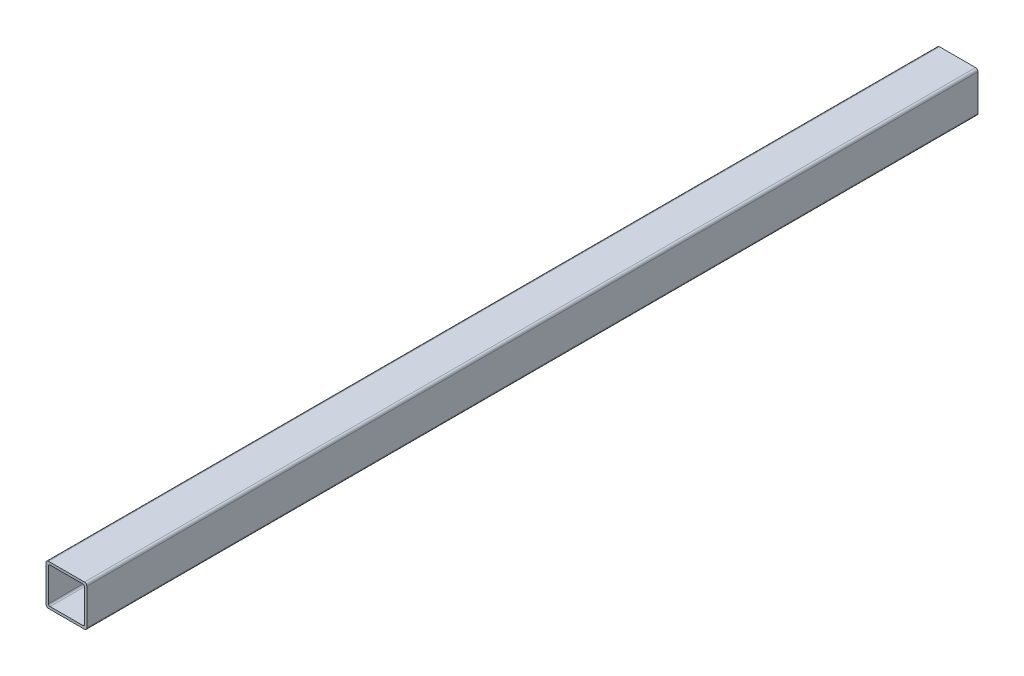
ISO-10303-21;
HEADER;
FILE_DESCRIPTION(('STEP AP214'),'2;1');
FILE_NAME('part.step','',(''),(''),'','','');
FILE_SCHEMA(('AUTOMOTIVE_DESIGN { 1 0 10303 214 1 1 1 1 }'));
ENDSEC;
DATA;
#1=APPLICATION_CONTEXT('core data for automotive mechanical design processes');
#2=APPLICATION_PROTOCOL_DEFINITION('international standard','automotive_design',2000,#1);
#3=PRODUCT_CONTEXT('',#1,'mechanical');
#4=PRODUCT('Part','Part','',(#3));
#5=PRODUCT_RELATED_PRODUCT_CATEGORY('part','',(#4));
#6=PRODUCT_DEFINITION_FORMATION('','',#4);
#7=PRODUCT_DEFINITION_CONTEXT('part definition',#1,'design');
#8=PRODUCT_DEFINITION('design','',#6,#7);
#9=PRODUCT_DEFINITION_SHAPE('','',#8);
#10=(LENGTH_UNIT() NAMED_UNIT(*) SI_UNIT(.MILLI.,.METRE.));
#11=(NAMED_UNIT(*) PLANE_ANGLE_UNIT() SI_UNIT($,.RADIAN.));
#12=(NAMED_UNIT(*) SI_UNIT($,.STERADIAN.) SOLID_ANGLE_UNIT());
#13=UNCERTAINTY_MEASURE_WITH_UNIT(LENGTH_MEASURE(1.E-05),#10,'distance_accuracy_value','');
#14=(GEOMETRIC_REPRESENTATION_CONTEXT(3) GLOBAL_UNCERTAINTY_ASSIGNED_CONTEXT((#13)) GLOBAL_UNIT_ASSIGNED_CONTEXT((#10,
#11,#12)) REPRESENTATION_CONTEXT('',''));
#15=CARTESIAN_POINT('',(0.,0.,0.));
#16=DIRECTION('',(0.,0.,1.));
#17=DIRECTION('',(1.,0.,0.));
#18=AXIS2_PLACEMENT_3D('',#15,#16,#17);
#19=CARTESIAN_POINT('',(-22.,-25.,-1160.71067811867));
#20=DIRECTION('',(0.,-1.,0.));
#21=DIRECTION('',(0.,0.,-1.));
#22=AXIS2_PLACEMENT_3D('',#19,#20,#21);
#23=PLANE('',#22);
#24=DIRECTION('',(-1.,0.,0.));
#25=VECTOR('',#24,1.);
#26=CARTESIAN_POINT('',(-22.,-25.,-1090.00000000001));
#27=LINE('',#26,#25);
#28=CARTESIAN_POINT('',(22.,-25.,-1090.00000000001));
#29=VERTEX_POINT('',#28);
#30=CARTESIAN_POINT('',(-22.,-25.,-1090.00000000001));
#31=VERTEX_POINT('',#30);
#32=EDGE_CURVE('E11',#29,#31,#27,.T.);
#33=ORIENTED_EDGE('',*,*,#32,.F.);
#34=DIRECTION('',(0.,0.,1.));
#35=VECTOR('',#34,1.);
#36=CARTESIAN_POINT('',(22.,-25.,-1160.71067811867));
#37=LINE('',#36,#35);
#38=CARTESIAN_POINT('',(22.,-25.,0.));
#39=VERTEX_POINT('',#38);
#40=EDGE_CURVE('E234',#29,#39,#37,.T.);
#41=ORIENTED_EDGE('',*,*,#40,.T.);
#42=DIRECTION('',(1.,0.,0.));
#43=VECTOR('',#42,1.);
#44=CARTESIAN_POINT('',(-22.,-25.,0.));
#45=LINE('',#44,#43);
#46=CARTESIAN_POINT('',(-22.,-25.,0.));
#47=VERTEX_POINT('',#46);
#48=EDGE_CURVE('E200',#47,#39,#45,.T.);
#49=ORIENTED_EDGE('',*,*,#48,.F.);
#50=DIRECTION('',(0.,0.,1.));
#51=VECTOR('',#50,1.);
#52=CARTESIAN_POINT('',(-22.,-25.,-1160.71067811867));
#53=LINE('',#52,#51);
#54=EDGE_CURVE('E221',#31,#47,#53,.T.);
#55=ORIENTED_EDGE('',*,*,#54,.F.);
#56=EDGE_LOOP('',(#33,#41,#49,#55));
#57=FACE_BOUND('',#56,.T.);
#58=ADVANCED_FACE('F35',(#57),#23,.T.);
#59=CARTESIAN_POINT('',(22.,-22.,-1160.71067811867));
#60=DIRECTION('',(0.,0.,1.));
#61=DIRECTION('',(1.,0.,0.));
#62=AXIS2_PLACEMENT_3D('',#59,#60,#61);
#63=CYLINDRICAL_SURFACE('',#62,3.);
#64=CARTESIAN_POINT('',(22.,-22.,-1090.00000000001));
#65=DIRECTION('',(0.,0.,1.));
#66=DIRECTION('',(1.,0.,0.));
#67=AXIS2_PLACEMENT_3D('',#64,#65,#66);
#68=CIRCLE('',#67,3.);
#69=CARTESIAN_POINT('',(25.,-22.,-1090.00000000001));
#70=VERTEX_POINT('',#69);
#71=EDGE_CURVE('E301',#70,#29,#68,.F.);
#72=ORIENTED_EDGE('',*,*,#71,.F.);
#73=DIRECTION('',(0.,0.,1.));
#74=VECTOR('',#73,1.);
#75=CARTESIAN_POINT('',(25.,-22.,-1160.71067811867));
#76=LINE('',#75,#74);
#77=CARTESIAN_POINT('',(25.,-22.,0.));
#78=VERTEX_POINT('',#77);
#79=EDGE_CURVE('E232',#70,#78,#76,.T.);
#80=ORIENTED_EDGE('',*,*,#79,.T.);
#81=CARTESIAN_POINT('',(22.,-22.,0.));
#82=DIRECTION('',(0.,0.,1.));
#83=DIRECTION('',(1.,0.,0.));
#84=AXIS2_PLACEMENT_3D('',#81,#82,#83);
#85=CIRCLE('',#84,3.);
#86=EDGE_CURVE('E203',#39,#78,#85,.T.);
#87=ORIENTED_EDGE('',*,*,#86,.F.);
#88=ORIENTED_EDGE('',*,*,#40,.F.);
#89=EDGE_LOOP('',(#72,#80,#87,#88));
#90=FACE_BOUND('',#89,.T.);
#91=ADVANCED_FACE('F325',(#90),#63,.T.);
#92=CARTESIAN_POINT('',(25.,22.,-1160.71067811867));
#93=DIRECTION('',(1.,0.,0.));
#94=DIRECTION('',(0.,0.,-1.));
#95=AXIS2_PLACEMENT_3D('',#92,#93,#94);
#96=PLANE('',#95);
#97=DIRECTION('',(0.,-1.,0.));
#98=VECTOR('',#97,1.);
#99=CARTESIAN_POINT('',(25.,22.,-1090.00000000001));
#100=LINE('',#99,#98);
#101=CARTESIAN_POINT('',(25.,22.,-1090.00000000001));
#102=VERTEX_POINT('',#101);
#103=EDGE_CURVE('E303',#102,#70,#100,.T.);
#104=ORIENTED_EDGE('',*,*,#103,.F.);
#105=DIRECTION('',(0.,0.,1.));
#106=VECTOR('',#105,1.);
#107=CARTESIAN_POINT('',(25.,22.,-1160.71067811867));
#108=LINE('',#107,#106);
#109=CARTESIAN_POINT('',(25.,22.,0.));
#110=VERTEX_POINT('',#109);
#111=EDGE_CURVE('E230',#102,#110,#108,.T.);
#112=ORIENTED_EDGE('',*,*,#111,.T.);
#113=DIRECTION('',(0.,1.,0.));
#114=VECTOR('',#113,1.);
#115=CARTESIAN_POINT('',(25.,22.,0.));
#116=LINE('',#115,#114);
#117=EDGE_CURVE('E206',#78,#110,#116,.T.);
#118=ORIENTED_EDGE('',*,*,#117,.F.);
#119=ORIENTED_EDGE('',*,*,#79,.F.);
#120=EDGE_LOOP('',(#104,#112,#118,#119));
#121=FACE_BOUND('',#120,.T.);
#122=ADVANCED_FACE('F322',(#121),#96,.T.);
#123=CARTESIAN_POINT('',(22.,22.,-1160.71067811867));
#124=DIRECTION('',(0.,0.,1.));
#125=DIRECTION('',(1.,0.,0.));
#126=AXIS2_PLACEMENT_3D('',#123,#124,#125);
#127=CYLINDRICAL_SURFACE('',#126,3.00000000000001);
#128=CARTESIAN_POINT('',(22.,22.,-1090.00000000001));
#129=DIRECTION('',(0.,0.,1.));
#130=DIRECTION('',(1.,0.,0.));
#131=AXIS2_PLACEMENT_3D('',#128,#129,#130);
#132=CIRCLE('',#131,3.00000000000001);
#133=CARTESIAN_POINT('',(22.,25.,-1090.00000000001));
#134=VERTEX_POINT('',#133);
#135=EDGE_CURVE('E305',#134,#102,#132,.F.);
#136=ORIENTED_EDGE('',*,*,#135,.F.);
#137=DIRECTION('',(0.,0.,1.));
#138=VECTOR('',#137,1.);
#139=CARTESIAN_POINT('',(22.,25.,-1160.71067811867));
#140=LINE('',#139,#138);
#141=CARTESIAN_POINT('',(22.,25.,0.));
#142=VERTEX_POINT('',#141);
#143=EDGE_CURVE('E228',#134,#142,#140,.T.);
#144=ORIENTED_EDGE('',*,*,#143,.T.);
#145=CARTESIAN_POINT('',(22.,22.,0.));
#146=DIRECTION('',(0.,0.,1.));
#147=DIRECTION('',(-1.,0.,0.));
#148=AXIS2_PLACEMENT_3D('',#145,#146,#147);
#149=CIRCLE('',#148,3.00000000000001);
#150=EDGE_CURVE('E209',#110,#142,#149,.T.);
#151=ORIENTED_EDGE('',*,*,#150,.F.);
#152=ORIENTED_EDGE('',*,*,#111,.F.);
#153=EDGE_LOOP('',(#136,#144,#151,#152));
#154=FACE_BOUND('',#153,.T.);
#155=ADVANCED_FACE('F315',(#154),#127,.T.);
#156=CARTESIAN_POINT('',(-22.,25.,-1160.71067811867));
#157=DIRECTION('',(0.,1.,0.));
#158=DIRECTION('',(-1.,0.,0.));
#159=AXIS2_PLACEMENT_3D('',#156,#157,#158);
#160=PLANE('',#159);
#161=DIRECTION('',(1.,0.,0.));
#162=VECTOR('',#161,1.);
#163=CARTESIAN_POINT('',(-22.,25.,-1090.00000000001));
#164=LINE('',#163,#162);
#165=CARTESIAN_POINT('',(-22.,25.,-1090.00000000001));
#166=VERTEX_POINT('',#165);
#167=EDGE_CURVE('E259',#166,#134,#164,.T.);
#168=ORIENTED_EDGE('',*,*,#167,.F.);
#169=DIRECTION('',(0.,0.,1.));
#170=VECTOR('',#169,1.);
#171=CARTESIAN_POINT('',(-22.,25.,-1160.71067811867));
#172=LINE('',#171,#170);
#173=CARTESIAN_POINT('',(-22.,25.,0.));
#174=VERTEX_POINT('',#173);
#175=EDGE_CURVE('E226',#166,#174,#172,.T.);
#176=ORIENTED_EDGE('',*,*,#175,.T.);
#177=DIRECTION('',(-1.,0.,0.));
#178=VECTOR('',#177,1.);
#179=CARTESIAN_POINT('',(-22.,25.,0.));
#180=LINE('',#179,#178);
#181=EDGE_CURVE('E212',#142,#174,#180,.T.);
#182=ORIENTED_EDGE('',*,*,#181,.F.);
#183=ORIENTED_EDGE('',*,*,#143,.F.);
#184=EDGE_LOOP('',(#168,#176,#182,#183));
#185=FACE_BOUND('',#184,.T.);
#186=ADVANCED_FACE('F318',(#185),#160,.T.);
#187=CARTESIAN_POINT('',(-22.,22.,-1160.71067811867));
#188=DIRECTION('',(0.,0.,1.));
#189=DIRECTION('',(1.,0.,0.));
#190=AXIS2_PLACEMENT_3D('',#187,#188,#189);
#191=CYLINDRICAL_SURFACE('',#190,3.);
#192=CARTESIAN_POINT('',(-22.,22.,-1090.00000000001));
#193=DIRECTION('',(0.,0.,1.));
#194=DIRECTION('',(1.,0.,0.));
#195=AXIS2_PLACEMENT_3D('',#192,#193,#194);
#196=CIRCLE('',#195,3.);
#197=CARTESIAN_POINT('',(-25.,22.,-1090.00000000001));
#198=VERTEX_POINT('',#197);
#199=EDGE_CURVE('E255',#198,#166,#196,.F.);
#200=ORIENTED_EDGE('',*,*,#199,.F.);
#201=DIRECTION('',(0.,0.,1.));
#202=VECTOR('',#201,1.);
#203=CARTESIAN_POINT('',(-25.,22.,-1160.71067811867));
#204=LINE('',#203,#202);
#205=CARTESIAN_POINT('',(-25.,22.,0.));
#206=VERTEX_POINT('',#205);
#207=EDGE_CURVE('E224',#198,#206,#204,.T.);
#208=ORIENTED_EDGE('',*,*,#207,.T.);
#209=CARTESIAN_POINT('',(-22.,22.,0.));
#210=DIRECTION('',(0.,0.,1.));
#211=DIRECTION('',(1.,0.,0.));
#212=AXIS2_PLACEMENT_3D('',#209,#210,#211);
#213=CIRCLE('',#212,3.);
#214=EDGE_CURVE('E215',#174,#206,#213,.T.);
#215=ORIENTED_EDGE('',*,*,#214,.F.);
#216=ORIENTED_EDGE('',*,*,#175,.F.);
#217=EDGE_LOOP('',(#200,#208,#215,#216));
#218=FACE_BOUND('',#217,.T.);
#219=ADVANCED_FACE('F338',(#218),#191,.T.);
#220=CARTESIAN_POINT('',(-25.,22.,-1160.71067811867));
#221=DIRECTION('',(-1.,0.,0.));
#222=DIRECTION('',(0.,0.,1.));
#223=AXIS2_PLACEMENT_3D('',#220,#221,#222);
#224=PLANE('',#223);
#225=DIRECTION('',(0.,1.,0.));
#226=VECTOR('',#225,1.);
#227=CARTESIAN_POINT('',(-25.,22.,-1090.00000000001));
#228=LINE('',#227,#226);
#229=CARTESIAN_POINT('',(-25.,-22.,-1090.00000000001));
#230=VERTEX_POINT('',#229);
#231=EDGE_CURVE('E252',#230,#198,#228,.T.);
#232=ORIENTED_EDGE('',*,*,#231,.F.);
#233=DIRECTION('',(0.,0.,1.));
#234=VECTOR('',#233,1.);
#235=CARTESIAN_POINT('',(-25.,-22.,-1160.71067811867));
#236=LINE('',#235,#234);
#237=CARTESIAN_POINT('',(-25.,-22.,0.));
#238=VERTEX_POINT('',#237);
#239=EDGE_CURVE('E222',#230,#238,#236,.T.);
#240=ORIENTED_EDGE('',*,*,#239,.T.);
#241=DIRECTION('',(0.,-1.,0.));
#242=VECTOR('',#241,1.);
#243=CARTESIAN_POINT('',(-25.,22.,0.));
#244=LINE('',#243,#242);
#245=EDGE_CURVE('E218',#206,#238,#244,.T.);
#246=ORIENTED_EDGE('',*,*,#245,.F.);
#247=ORIENTED_EDGE('',*,*,#207,.F.);
#248=EDGE_LOOP('',(#232,#240,#246,#247));
#249=FACE_BOUND('',#248,.T.);
#250=ADVANCED_FACE('F251',(#249),#224,.T.);
#251=CARTESIAN_POINT('',(-22.,-22.,-1160.71067811867));
#252=DIRECTION('',(0.,0.,1.));
#253=DIRECTION('',(1.,0.,0.));
#254=AXIS2_PLACEMENT_3D('',#251,#252,#253);
#255=CYLINDRICAL_SURFACE('',#254,3.);
#256=CARTESIAN_POINT('',(-22.,-22.,-1090.00000000001));
#257=DIRECTION('',(0.,0.,1.));
#258=DIRECTION('',(1.,0.,0.));
#259=AXIS2_PLACEMENT_3D('',#256,#257,#258);
#260=CIRCLE('',#259,3.);
#261=EDGE_CURVE('E241',#31,#230,#260,.F.);
#262=ORIENTED_EDGE('',*,*,#261,.F.);
#263=ORIENTED_EDGE('',*,*,#54,.T.);
#264=CARTESIAN_POINT('',(-22.,-22.,0.));
#265=DIRECTION('',(0.,0.,1.));
#266=DIRECTION('',(1.,0.,0.));
#267=AXIS2_PLACEMENT_3D('',#264,#265,#266);
#268=CIRCLE('',#267,3.);
#269=EDGE_CURVE('E187',#238,#47,#268,.T.);
#270=ORIENTED_EDGE('',*,*,#269,.F.);
#271=ORIENTED_EDGE('',*,*,#239,.F.);
#272=EDGE_LOOP('',(#262,#263,#270,#271));
#273=FACE_BOUND('',#272,.T.);
#274=ADVANCED_FACE('F37',(#273),#255,.T.);
#275=CARTESIAN_POINT('',(-22.,-22.,0.));
#276=DIRECTION('',(0.,0.,1.));
#277=DIRECTION('',(1.,0.,0.));
#278=AXIS2_PLACEMENT_3D('',#275,#276,#277);
#279=PLANE('',#278);
#280=CARTESIAN_POINT('',(-20.,-20.,0.));
#281=DIRECTION('',(0.,0.,1.));
#282=DIRECTION('',(1.,0.,0.));
#283=AXIS2_PLACEMENT_3D('',#280,#281,#282);
#284=CIRCLE('',#283,2.);
#285=CARTESIAN_POINT('',(-22.,-20.,0.));
#286=VERTEX_POINT('',#285);
#287=CARTESIAN_POINT('',(-20.,-22.,0.));
#288=VERTEX_POINT('',#287);
#289=EDGE_CURVE('E162',#286,#288,#284,.T.);
#290=ORIENTED_EDGE('',*,*,#289,.F.);
#291=DIRECTION('',(0.,-1.,0.));
#292=VECTOR('',#291,1.);
#293=CARTESIAN_POINT('',(-22.,20.,0.));
#294=LINE('',#293,#292);
#295=CARTESIAN_POINT('',(-22.,20.,0.));
#296=VERTEX_POINT('',#295);
#297=EDGE_CURVE('E182',#296,#286,#294,.T.);
#298=ORIENTED_EDGE('',*,*,#297,.F.);
#299=CARTESIAN_POINT('',(-20.,20.,0.));
#300=DIRECTION('',(0.,0.,1.));
#301=DIRECTION('',(1.,0.,0.));
#302=AXIS2_PLACEMENT_3D('',#299,#300,#301);
#303=CIRCLE('',#302,2.);
#304=CARTESIAN_POINT('',(-20.,22.,0.));
#305=VERTEX_POINT('',#304);
#306=EDGE_CURVE('E179',#305,#296,#303,.T.);
#307=ORIENTED_EDGE('',*,*,#306,.F.);
#308=DIRECTION('',(-1.,0.,0.));
#309=VECTOR('',#308,1.);
#310=CARTESIAN_POINT('',(-20.,22.,0.));
#311=LINE('',#310,#309);
#312=CARTESIAN_POINT('',(20.,22.,0.));
#313=VERTEX_POINT('',#312);
#314=EDGE_CURVE('E176',#313,#305,#311,.T.);
#315=ORIENTED_EDGE('',*,*,#314,.F.);
#316=CARTESIAN_POINT('',(20.,20.,0.));
#317=DIRECTION('',(0.,0.,1.));
#318=DIRECTION('',(-1.,0.,0.));
#319=AXIS2_PLACEMENT_3D('',#316,#317,#318);
#320=CIRCLE('',#319,2.);
#321=CARTESIAN_POINT('',(22.,20.,0.));
#322=VERTEX_POINT('',#321);
#323=EDGE_CURVE('E170',#322,#313,#320,.T.);
#324=ORIENTED_EDGE('',*,*,#323,.F.);
#325=DIRECTION('',(0.,1.,0.));
#326=VECTOR('',#325,1.);
#327=CARTESIAN_POINT('',(22.,20.,0.));
#328=LINE('',#327,#326);
#329=CARTESIAN_POINT('',(22.,-20.,0.));
#330=VERTEX_POINT('',#329);
#331=EDGE_CURVE('E168',#330,#322,#328,.T.);
#332=ORIENTED_EDGE('',*,*,#331,.F.);
#333=CARTESIAN_POINT('',(20.,-20.,0.));
#334=DIRECTION('',(0.,0.,1.));
#335=DIRECTION('',(1.,0.,0.));
#336=AXIS2_PLACEMENT_3D('',#333,#334,#335);
#337=CIRCLE('',#336,2.);
#338=CARTESIAN_POINT('',(20.,-22.,0.));
#339=VERTEX_POINT('',#338);
#340=EDGE_CURVE('E149',#339,#330,#337,.T.);
#341=ORIENTED_EDGE('',*,*,#340,.F.);
#342=DIRECTION('',(1.,0.,0.));
#343=VECTOR('',#342,1.);
#344=CARTESIAN_POINT('',(-20.,-22.,0.));
#345=LINE('',#344,#343);
#346=EDGE_CURVE('E156',#288,#339,#345,.T.);
#347=ORIENTED_EDGE('',*,*,#346,.F.);
#348=EDGE_LOOP('',(#290,#298,#307,#315,#324,#332,#341,#347));
#349=FACE_BOUND('',#348,.T.);
#350=ORIENTED_EDGE('',*,*,#269,.T.);
#351=ORIENTED_EDGE('',*,*,#48,.T.);
#352=ORIENTED_EDGE('',*,*,#86,.T.);
#353=ORIENTED_EDGE('',*,*,#117,.T.);
#354=ORIENTED_EDGE('',*,*,#150,.T.);
#355=ORIENTED_EDGE('',*,*,#181,.T.);
#356=ORIENTED_EDGE('',*,*,#214,.T.);
#357=ORIENTED_EDGE('',*,*,#245,.T.);
#358=EDGE_LOOP('',(#350,#351,#352,#353,#354,#355,#356,#357));
#359=FACE_BOUND('',#358,.T.);
#360=ADVANCED_FACE('F164',(#349,#359),#279,.T.);
#361=CARTESIAN_POINT('',(-20.,-22.,-1160.71067811867));
#362=DIRECTION('',(0.,-1.,0.));
#363=DIRECTION('',(0.,0.,-1.));
#364=AXIS2_PLACEMENT_3D('',#361,#362,#363);
#365=PLANE('',#364);
#366=DIRECTION('',(0.,0.,1.));
#367=VECTOR('',#366,1.);
#368=CARTESIAN_POINT('',(20.,-22.,-1160.71067811867));
#369=LINE('',#368,#367);
#370=CARTESIAN_POINT('',(20.,-22.,-1090.00000000001));
#371=VERTEX_POINT('',#370);
#372=EDGE_CURVE('E145',#371,#339,#369,.T.);
#373=ORIENTED_EDGE('',*,*,#372,.F.);
#374=DIRECTION('',(-1.,0.,0.));
#375=VECTOR('',#374,1.);
#376=CARTESIAN_POINT('',(-20.,-22.,-1090.00000000001));
#377=LINE('',#376,#375);
#378=CARTESIAN_POINT('',(-20.,-22.,-1090.00000000001));
#379=VERTEX_POINT('',#378);
#380=EDGE_CURVE('E39',#371,#379,#377,.T.);
#381=ORIENTED_EDGE('',*,*,#380,.T.);
#382=DIRECTION('',(0.,0.,1.));
#383=VECTOR('',#382,1.);
#384=CARTESIAN_POINT('',(-20.,-22.,-1160.71067811867));
#385=LINE('',#384,#383);
#386=EDGE_CURVE('E153',#379,#288,#385,.T.);
#387=ORIENTED_EDGE('',*,*,#386,.T.);
#388=ORIENTED_EDGE('',*,*,#346,.T.);
#389=EDGE_LOOP('',(#373,#381,#387,#388));
#390=FACE_BOUND('',#389,.T.);
#391=ADVANCED_FACE('F157',(#390),#365,.F.);
#392=CARTESIAN_POINT('',(20.,-20.,-1160.71067811867));
#393=DIRECTION('',(0.,0.,1.));
#394=DIRECTION('',(1.,0.,0.));
#395=AXIS2_PLACEMENT_3D('',#392,#393,#394);
#396=CYLINDRICAL_SURFACE('',#395,2.);
#397=DIRECTION('',(0.,0.,1.));
#398=VECTOR('',#397,1.);
#399=CARTESIAN_POINT('',(22.,-20.,-1160.71067811867));
#400=LINE('',#399,#398);
#401=CARTESIAN_POINT('',(22.,-20.,-1090.00000000001));
#402=VERTEX_POINT('',#401);
#403=EDGE_CURVE('E152',#402,#330,#400,.T.);
#404=ORIENTED_EDGE('',*,*,#403,.F.);
#405=CARTESIAN_POINT('',(20.,-20.,-1090.00000000001));
#406=DIRECTION('',(0.,0.,1.));
#407=DIRECTION('',(1.,0.,0.));
#408=AXIS2_PLACEMENT_3D('',#405,#406,#407);
#409=CIRCLE('',#408,2.);
#410=EDGE_CURVE('E44',#402,#371,#409,.F.);
#411=ORIENTED_EDGE('',*,*,#410,.T.);
#412=ORIENTED_EDGE('',*,*,#372,.T.);
#413=ORIENTED_EDGE('',*,*,#340,.T.);
#414=EDGE_LOOP('',(#404,#411,#412,#413));
#415=FACE_BOUND('',#414,.T.);
#416=ADVANCED_FACE('F147',(#415),#396,.F.);
#417=CARTESIAN_POINT('',(22.,20.,-1160.71067811867));
#418=DIRECTION('',(1.,0.,0.));
#419=DIRECTION('',(0.,0.,-1.));
#420=AXIS2_PLACEMENT_3D('',#417,#418,#419);
#421=PLANE('',#420);
#422=DIRECTION('',(0.,0.,1.));
#423=VECTOR('',#422,1.);
#424=CARTESIAN_POINT('',(22.,20.,-1160.71067811867));
#425=LINE('',#424,#423);
#426=CARTESIAN_POINT('',(22.,20.,-1090.00000000001));
#427=VERTEX_POINT('',#426);
#428=EDGE_CURVE('E194',#427,#322,#425,.T.);
#429=ORIENTED_EDGE('',*,*,#428,.F.);
#430=DIRECTION('',(0.,-1.,0.));
#431=VECTOR('',#430,1.);
#432=CARTESIAN_POINT('',(22.,20.,-1090.00000000001));
#433=LINE('',#432,#431);
#434=EDGE_CURVE('E291',#427,#402,#433,.T.);
#435=ORIENTED_EDGE('',*,*,#434,.T.);
#436=ORIENTED_EDGE('',*,*,#403,.T.);
#437=ORIENTED_EDGE('',*,*,#331,.T.);
#438=EDGE_LOOP('',(#429,#435,#436,#437));
#439=FACE_BOUND('',#438,.T.);
#440=ADVANCED_FACE('F290',(#439),#421,.F.);
#441=CARTESIAN_POINT('',(20.,20.,-1160.71067811867));
#442=DIRECTION('',(0.,0.,1.));
#443=DIRECTION('',(1.,0.,0.));
#444=AXIS2_PLACEMENT_3D('',#441,#442,#443);
#445=CYLINDRICAL_SURFACE('',#444,2.);
#446=DIRECTION('',(0.,0.,1.));
#447=VECTOR('',#446,1.);
#448=CARTESIAN_POINT('',(20.,22.,-1160.71067811867));
#449=LINE('',#448,#447);
#450=CARTESIAN_POINT('',(20.,22.,-1090.00000000001));
#451=VERTEX_POINT('',#450);
#452=EDGE_CURVE('E192',#451,#313,#449,.T.);
#453=ORIENTED_EDGE('',*,*,#452,.F.);
#454=CARTESIAN_POINT('',(20.,20.,-1090.00000000001));
#455=DIRECTION('',(0.,0.,1.));
#456=DIRECTION('',(1.,0.,0.));
#457=AXIS2_PLACEMENT_3D('',#454,#455,#456);
#458=CIRCLE('',#457,2.);
#459=EDGE_CURVE('E287',#451,#427,#458,.F.);
#460=ORIENTED_EDGE('',*,*,#459,.T.);
#461=ORIENTED_EDGE('',*,*,#428,.T.);
#462=ORIENTED_EDGE('',*,*,#323,.T.);
#463=EDGE_LOOP('',(#453,#460,#461,#462));
#464=FACE_BOUND('',#463,.T.);
#465=ADVANCED_FACE('F284',(#464),#445,.F.);
#466=CARTESIAN_POINT('',(-20.,22.,-1160.71067811867));
#467=DIRECTION('',(0.,1.,0.));
#468=DIRECTION('',(0.,0.,1.));
#469=AXIS2_PLACEMENT_3D('',#466,#467,#468);
#470=PLANE('',#469);
#471=DIRECTION('',(0.,0.,1.));
#472=VECTOR('',#471,1.);
#473=CARTESIAN_POINT('',(-20.,22.,-1160.71067811867));
#474=LINE('',#473,#472);
#475=CARTESIAN_POINT('',(-20.,22.,-1090.00000000001));
#476=VERTEX_POINT('',#475);
#477=EDGE_CURVE('E190',#476,#305,#474,.T.);
#478=ORIENTED_EDGE('',*,*,#477,.F.);
#479=DIRECTION('',(1.,0.,0.));
#480=VECTOR('',#479,1.);
#481=CARTESIAN_POINT('',(-20.,22.,-1090.00000000001));
#482=LINE('',#481,#480);
#483=EDGE_CURVE('E294',#476,#451,#482,.T.);
#484=ORIENTED_EDGE('',*,*,#483,.T.);
#485=ORIENTED_EDGE('',*,*,#452,.T.);
#486=ORIENTED_EDGE('',*,*,#314,.T.);
#487=EDGE_LOOP('',(#478,#484,#485,#486));
#488=FACE_BOUND('',#487,.T.);
#489=ADVANCED_FACE('F281',(#488),#470,.F.);
#490=CARTESIAN_POINT('',(-20.,20.,-1160.71067811867));
#491=DIRECTION('',(0.,0.,1.));
#492=DIRECTION('',(1.,0.,0.));
#493=AXIS2_PLACEMENT_3D('',#490,#491,#492);
#494=CYLINDRICAL_SURFACE('',#493,2.);
#495=DIRECTION('',(0.,0.,1.));
#496=VECTOR('',#495,1.);
#497=CARTESIAN_POINT('',(-22.,20.,-1160.71067811867));
#498=LINE('',#497,#496);
#499=CARTESIAN_POINT('',(-22.,20.,-1090.00000000001));
#500=VERTEX_POINT('',#499);
#501=EDGE_CURVE('E188',#500,#296,#498,.T.);
#502=ORIENTED_EDGE('',*,*,#501,.F.);
#503=CARTESIAN_POINT('',(-20.,20.,-1090.00000000001));
#504=DIRECTION('',(0.,0.,1.));
#505=DIRECTION('',(1.,0.,0.));
#506=AXIS2_PLACEMENT_3D('',#503,#504,#505);
#507=CIRCLE('',#506,2.);
#508=EDGE_CURVE('E278',#500,#476,#507,.F.);
#509=ORIENTED_EDGE('',*,*,#508,.T.);
#510=ORIENTED_EDGE('',*,*,#477,.T.);
#511=ORIENTED_EDGE('',*,*,#306,.T.);
#512=EDGE_LOOP('',(#502,#509,#510,#511));
#513=FACE_BOUND('',#512,.T.);
#514=ADVANCED_FACE('F276',(#513),#494,.F.);
#515=CARTESIAN_POINT('',(-22.,20.,-1160.71067811867));
#516=DIRECTION('',(-1.,0.,0.));
#517=DIRECTION('',(0.,0.,1.));
#518=AXIS2_PLACEMENT_3D('',#515,#516,#517);
#519=PLANE('',#518);
#520=DIRECTION('',(0.,0.,1.));
#521=VECTOR('',#520,1.);
#522=CARTESIAN_POINT('',(-22.,-20.,-1160.71067811867));
#523=LINE('',#522,#521);
#524=CARTESIAN_POINT('',(-22.,-20.,-1090.00000000001));
#525=VERTEX_POINT('',#524);
#526=EDGE_CURVE('E185',#525,#286,#523,.T.);
#527=ORIENTED_EDGE('',*,*,#526,.F.);
#528=DIRECTION('',(0.,1.,0.));
#529=VECTOR('',#528,1.);
#530=CARTESIAN_POINT('',(-22.,20.,-1090.00000000001));
#531=LINE('',#530,#529);
#532=EDGE_CURVE('E273',#525,#500,#531,.T.);
#533=ORIENTED_EDGE('',*,*,#532,.T.);
#534=ORIENTED_EDGE('',*,*,#501,.T.);
#535=ORIENTED_EDGE('',*,*,#297,.T.);
#536=EDGE_LOOP('',(#527,#533,#534,#535));
#537=FACE_BOUND('',#536,.T.);
#538=ADVANCED_FACE('F270',(#537),#519,.F.);
#539=CARTESIAN_POINT('',(-20.,-20.,-1160.71067811867));
#540=DIRECTION('',(0.,0.,1.));
#541=DIRECTION('',(1.,0.,0.));
#542=AXIS2_PLACEMENT_3D('',#539,#540,#541);
#543=CYLINDRICAL_SURFACE('',#542,2.);
#544=ORIENTED_EDGE('',*,*,#386,.F.);
#545=CARTESIAN_POINT('',(-20.,-20.,-1090.00000000001));
#546=DIRECTION('',(0.,0.,1.));
#547=DIRECTION('',(1.,0.,0.));
#548=AXIS2_PLACEMENT_3D('',#545,#546,#547);
#549=CIRCLE('',#548,2.);
#550=EDGE_CURVE('E257',#379,#525,#549,.F.);
#551=ORIENTED_EDGE('',*,*,#550,.T.);
#552=ORIENTED_EDGE('',*,*,#526,.T.);
#553=ORIENTED_EDGE('',*,*,#289,.T.);
#554=EDGE_LOOP('',(#544,#551,#552,#553));
#555=FACE_BOUND('',#554,.T.);
#556=ADVANCED_FACE('F263',(#555),#543,.F.);
#557=CARTESIAN_POINT('',(22.,-300.,-1090.00000000001));
#558=DIRECTION('',(0.,0.,1.));
#559=DIRECTION('',(1.,0.,0.));
#560=AXIS2_PLACEMENT_3D('',#557,#558,#559);
#561=PLANE('',#560);
#562=ORIENTED_EDGE('',*,*,#261,.T.);
#563=ORIENTED_EDGE('',*,*,#231,.T.);
#564=ORIENTED_EDGE('',*,*,#199,.T.);
#565=ORIENTED_EDGE('',*,*,#167,.T.);
#566=ORIENTED_EDGE('',*,*,#135,.T.);
#567=ORIENTED_EDGE('',*,*,#103,.T.);
#568=ORIENTED_EDGE('',*,*,#71,.T.);
#569=ORIENTED_EDGE('',*,*,#32,.T.);
#570=EDGE_LOOP('',(#562,#563,#564,#565,#566,#567,#568,#569));
#571=FACE_BOUND('',#570,.T.);
#572=ORIENTED_EDGE('',*,*,#380,.F.);
#573=ORIENTED_EDGE('',*,*,#410,.F.);
#574=ORIENTED_EDGE('',*,*,#434,.F.);
#575=ORIENTED_EDGE('',*,*,#459,.F.);
#576=ORIENTED_EDGE('',*,*,#483,.F.);
#577=ORIENTED_EDGE('',*,*,#508,.F.);
#578=ORIENTED_EDGE('',*,*,#532,.F.);
#579=ORIENTED_EDGE('',*,*,#550,.F.);
#580=EDGE_LOOP('',(#572,#573,#574,#575,#576,#577,#578,#579));
#581=FACE_BOUND('',#580,.T.);
#582=ADVANCED_FACE('F308',(#571,#581),#561,.F.);
#583=CLOSED_SHELL('',(#58,#91,#122,#155,#186,#219,#250,#274,#360,#391,#416,#440,#465,#489,#514,
#538,#556,#582));
#584=MANIFOLD_SOLID_BREP('B2',#583);
#585=ADVANCED_BREP_SHAPE_REPRESENTATION('',(#18,#584),#14);
#586=SHAPE_DEFINITION_REPRESENTATION(#9,#585);
ENDSEC;
END-ISO-10303-21;
